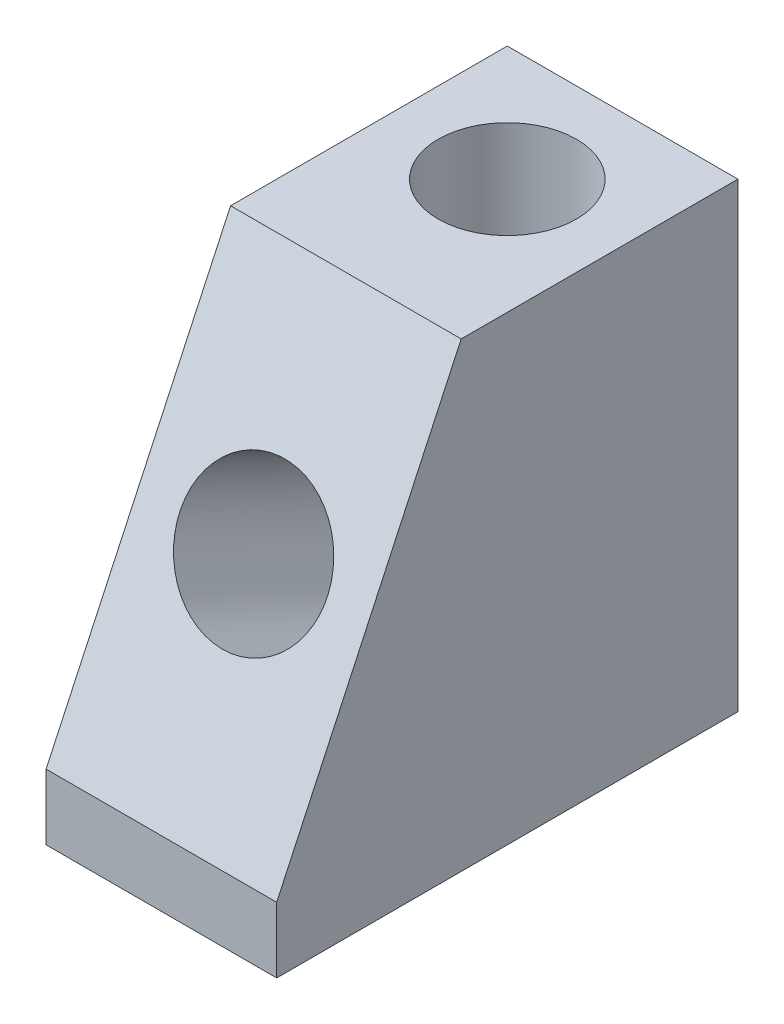
ISO-10303-21;
HEADER;
FILE_DESCRIPTION(('STEP AP214'),'2;1');
FILE_NAME('part.step','',(''),(''),'','','');
FILE_SCHEMA(('AUTOMOTIVE_DESIGN { 1 0 10303 214 1 1 1 1 }'));
ENDSEC;
DATA;
#1=APPLICATION_CONTEXT('core data for automotive mechanical design processes');
#2=APPLICATION_PROTOCOL_DEFINITION('international standard','automotive_design',2000,#1);
#3=PRODUCT_CONTEXT('',#1,'mechanical');
#4=PRODUCT('Part','Part','',(#3));
#5=PRODUCT_RELATED_PRODUCT_CATEGORY('part','',(#4));
#6=PRODUCT_DEFINITION_FORMATION('','',#4);
#7=PRODUCT_DEFINITION_CONTEXT('part definition',#1,'design');
#8=PRODUCT_DEFINITION('design','',#6,#7);
#9=PRODUCT_DEFINITION_SHAPE('','',#8);
#10=(LENGTH_UNIT() NAMED_UNIT(*) SI_UNIT(.MILLI.,.METRE.));
#11=(NAMED_UNIT(*) PLANE_ANGLE_UNIT() SI_UNIT($,.RADIAN.));
#12=(NAMED_UNIT(*) SI_UNIT($,.STERADIAN.) SOLID_ANGLE_UNIT());
#13=UNCERTAINTY_MEASURE_WITH_UNIT(LENGTH_MEASURE(1.E-05),#10,'distance_accuracy_value','');
#14=(GEOMETRIC_REPRESENTATION_CONTEXT(3) GLOBAL_UNCERTAINTY_ASSIGNED_CONTEXT((#13)) GLOBAL_UNIT_ASSIGNED_CONTEXT((#10,
#11,#12)) REPRESENTATION_CONTEXT('',''));
#15=CARTESIAN_POINT('',(0.,0.,0.));
#16=DIRECTION('',(0.,0.,1.));
#17=DIRECTION('',(1.,0.,0.));
#18=AXIS2_PLACEMENT_3D('',#15,#16,#17);
#19=CARTESIAN_POINT('',(2.5,10.,-7.5));
#20=DIRECTION('',(0.,-1.,0.));
#21=DIRECTION('',(0.,0.,-1.));
#22=AXIS2_PLACEMENT_3D('',#19,#20,#21);
#23=CYLINDRICAL_SURFACE('',#22,1.5);
#24=CARTESIAN_POINT('',(2.5,4.21223722223587,-9.));
#25=CARTESIAN_POINT('',(2.42330762249289,4.21223392992331,-8.99999513359401));
#26=CARTESIAN_POINT('',(2.34653717387851,4.20887122307844,-8.99408294465786));
#27=CARTESIAN_POINT('',(2.19527815618709,4.19563457547863,-8.97072174786232));
#28=CARTESIAN_POINT('',(2.12079365920482,4.18574964941164,-8.95325327573381));
#29=CARTESIAN_POINT('',(1.97651950271111,4.1601619341477,-8.90771798329861));
#30=CARTESIAN_POINT('',(1.90671408170912,4.14447997030643,-8.87968909353124));
#31=CARTESIAN_POINT('',(1.77312217393009,4.1082515946597,-8.8142239871317));
#32=CARTESIAN_POINT('',(1.70933296796309,4.08770739535023,-8.77679204875822));
#33=CARTESIAN_POINT('',(1.58524092715486,4.04158065306958,-8.69131265959869));
#34=CARTESIAN_POINT('',(1.52536629599283,4.01577225363752,-8.64276893676517));
#35=CARTESIAN_POINT('',(1.41417389690574,3.9615150542907,-8.5377139082359));
#36=CARTESIAN_POINT('',(1.36287649280973,3.93306021347177,-8.48118421288625));
#37=CARTESIAN_POINT('',(1.289649004553,3.88809002136716,-8.38708608725011));
#38=CARTESIAN_POINT('',(1.26458680577703,3.87171127951633,-8.35183863077607));
#39=CARTESIAN_POINT('',(1.21752105511538,3.83937871888568,-8.27917920409633));
#40=CARTESIAN_POINT('',(1.19551633793741,3.82342474010116,-8.24176806627225));
#41=CARTESIAN_POINT('',(1.1547039586765,3.79276230899111,-8.16488310867486));
#42=CARTESIAN_POINT('',(1.13588849463453,3.77805086263482,-8.1254146407083));
#43=CARTESIAN_POINT('',(1.10155125728673,3.75105223237606,-8.04431220144736));
#44=CARTESIAN_POINT('',(1.08602418756068,3.73876115241037,-8.00268184895877));
#45=CARTESIAN_POINT('',(1.06105465687156,3.72044057261015,-7.92517111105083));
#46=CARTESIAN_POINT('',(1.05101752408504,3.71367103431509,-7.88966498716163));
#47=CARTESIAN_POINT('',(1.0335203838158,3.70465031215013,-7.81749895590021));
#48=CARTESIAN_POINT('',(1.02605229122719,3.70238484377743,-7.7808430718622));
#49=CARTESIAN_POINT('',(1.01478144086655,3.70399504897451,-7.71247647320983));
#50=CARTESIAN_POINT('',(1.0106054717743,3.70703242652365,-7.68081472136506));
#51=CARTESIAN_POINT('',(1.00433560215379,3.71831388292309,-7.61822241410979));
#52=CARTESIAN_POINT('',(1.00224059640247,3.72655519409699,-7.58729147908534));
#53=CARTESIAN_POINT('',(0.999946295177163,3.74777875563823,-7.52723601320645));
#54=CARTESIAN_POINT('',(0.999737917319811,3.76073797932328,-7.49810349912474));
#55=CARTESIAN_POINT('',(1.00086403667655,3.79033023029926,-7.44180183658758));
#56=CARTESIAN_POINT('',(1.0022009463422,3.80696896909554,-7.41463582861313));
#57=CARTESIAN_POINT('',(1.00675021294701,3.84863802452953,-7.35362694563653));
#58=CARTESIAN_POINT('',(1.01043178746152,3.87463593374306,-7.32049344257166));
#59=CARTESIAN_POINT('',(1.01950532834895,3.92932541290561,-7.2567460327635));
#60=CARTESIAN_POINT('',(1.02490090670906,3.95802258038565,-7.22613762040821));
#61=CARTESIAN_POINT('',(1.03720367175321,4.01723267671696,-7.16659758369506));
#62=CARTESIAN_POINT('',(1.04412216907047,4.04775787696652,-7.13768067207515));
#63=CARTESIAN_POINT('',(1.05932983035496,4.10979116946164,-7.08128816094391));
#64=CARTESIAN_POINT('',(1.067619593825,4.14129968669281,-7.05381319878867));
#65=CARTESIAN_POINT('',(1.09610925673253,4.24251241559974,-6.96806811277513));
#66=CARTESIAN_POINT('',(1.11878944778657,4.31326872407115,-6.91185358853438));
#67=CARTESIAN_POINT('',(1.17052280338618,4.45514366247459,-6.80277802630925));
#68=CARTESIAN_POINT('',(1.1995837025293,4.52626262892469,-6.74992115956091));
#69=CARTESIAN_POINT('',(1.26439866725518,4.66698818907019,-6.64738900318956));
#70=CARTESIAN_POINT('',(1.30010918296998,4.73660150795882,-6.59769568580732));
#71=CARTESIAN_POINT('',(1.37912127633693,4.8734121886831,-6.50124441393895));
#72=CARTESIAN_POINT('',(1.42241257959403,4.94061267399527,-6.4544826013534));
#73=CARTESIAN_POINT('',(1.51070275181982,5.0614343862897,-6.37110197825496));
#74=CARTESIAN_POINT('',(1.55450258696856,5.11559422585441,-6.33400578107859));
#75=CARTESIAN_POINT('',(1.6494412934728,5.21972855177752,-6.26304136446136));
#76=CARTESIAN_POINT('',(1.70059144012739,5.26969641768434,-6.22917823984033));
#77=CARTESIAN_POINT('',(1.81185997509826,5.36385325651185,-6.16559620533507));
#78=CARTESIAN_POINT('',(1.87209139832378,5.40795389696297,-6.13594027310138));
#79=CARTESIAN_POINT('',(2.00147369960528,5.48602278571293,-6.08356610065351));
#80=CARTESIAN_POINT('',(2.07058633700837,5.5200325183632,-6.06081944653843));
#81=CARTESIAN_POINT('',(2.18872441954714,5.56330265493667,-6.03191489203331));
#82=CARTESIAN_POINT('',(2.2353651706665,5.57705547016753,-6.02273872873521));
#83=CARTESIAN_POINT('',(2.33074885768474,5.59795005738106,-6.00880325737052));
#84=CARTESIAN_POINT('',(2.37948977306093,5.60509804138691,-6.00403979902429));
#85=CARTESIAN_POINT('',(2.47791862704141,5.61213417699222,-5.99935084019958));
#86=CARTESIAN_POINT('',(2.52760939492366,5.61199546210785,-5.99944324356697));
#87=CARTESIAN_POINT('',(2.62618000114275,5.60440571518854,-6.00450121224601));
#88=CARTESIAN_POINT('',(2.6750595115383,5.59695179591847,-6.00946870170347));
#89=CARTESIAN_POINT('',(2.76864720025557,5.57587747613382,-6.02352474016199));
#90=CARTESIAN_POINT('',(2.81344427068626,5.56252394248289,-6.03243496576356));
#91=CARTESIAN_POINT('',(2.90028232723779,5.53068662132679,-6.05370258959758));
#92=CARTESIAN_POINT('',(2.94232218174715,5.51220074350221,-6.0660613923892));
#93=CARTESIAN_POINT('',(3.04794673041208,5.45856876359062,-6.10197018848805));
#94=CARTESIAN_POINT('',(3.10909289370975,5.42012625253008,-6.1277561879166));
#95=CARTESIAN_POINT('',(3.22347001362355,5.33590892421092,-6.18444243889166));
#96=CARTESIAN_POINT('',(3.27667769331167,5.29011333116441,-6.21535718996485));
#97=CARTESIAN_POINT('',(3.36726764312202,5.20194923987294,-6.27515056230556));
#98=CARTESIAN_POINT('',(3.40579669927178,5.16035147088573,-6.30346106828734));
#99=CARTESIAN_POINT('',(3.47839144591172,5.0746819083397,-6.36205075716396));
#100=CARTESIAN_POINT('',(3.51245389218277,5.03060834937298,-6.39233134736167));
#101=CARTESIAN_POINT('',(3.57659602417726,4.94059965986524,-6.45456148978628));
#102=CARTESIAN_POINT('',(3.60666652360471,4.89466054275019,-6.48651466338354));
#103=CARTESIAN_POINT('',(3.66311609964991,4.80152804818443,-6.55183122769838));
#104=CARTESIAN_POINT('',(3.68949425352094,4.75433436070041,-6.58519496822519));
#105=CARTESIAN_POINT('',(3.74398045382395,4.64925822171661,-6.66030289110211));
#106=CARTESIAN_POINT('',(3.77131173572406,4.59118980868495,-6.70234951367635));
#107=CARTESIAN_POINT('',(3.8214485371303,4.4745487244029,-6.78848045726772));
#108=CARTESIAN_POINT('',(3.84425078945591,4.41597572069953,-6.83256622123262));
#109=CARTESIAN_POINT('',(3.88550526925589,4.29935343777306,-6.9230737553539));
#110=CARTESIAN_POINT('',(3.90396796914357,4.24130322971325,-6.96948956673212));
#111=CARTESIAN_POINT('',(3.9366549777013,4.12688354903325,-7.0656989324888));
#112=CARTESIAN_POINT('',(3.95088495948526,4.07051191869913,-7.11548785492093));
#113=CARTESIAN_POINT('',(3.9707465389932,3.98023975061414,-7.20304175647294));
#114=CARTESIAN_POINT('',(3.97766197194851,3.94513218222246,-7.23925489797634));
#115=CARTESIAN_POINT('',(3.98907777653042,3.8785312399329,-7.31526194196179));
#116=CARTESIAN_POINT('',(3.99358246138401,3.84703149098224,-7.355049299563));
#117=CARTESIAN_POINT('',(3.99846813309645,3.79956935380887,-7.42628756563103));
#118=CARTESIAN_POINT('',(3.99969748682186,3.78182649207383,-7.45646290006844));
#119=CARTESIAN_POINT('',(4.000203224222,3.75110799520949,-7.51912904558163));
#120=CARTESIAN_POINT('',(3.99948571647177,3.73811759376213,-7.5516123035193));
#121=CARTESIAN_POINT('',(3.99568376761143,3.71805071528548,-7.6185632870877));
#122=CARTESIAN_POINT('',(3.99257930806566,3.71102531840868,-7.65304550416887));
#123=CARTESIAN_POINT('',(3.98383273665,3.70311382347832,-7.72241602737873));
#124=CARTESIAN_POINT('',(3.97818509342458,3.70224117677189,-7.75730505632844));
#125=CARTESIAN_POINT('',(3.962056248077,3.70595626184512,-7.83863012317192));
#126=CARTESIAN_POINT('',(3.95056959215159,3.71260199092554,-7.88474752379238));
#127=CARTESIAN_POINT('',(3.92367704388319,3.73128689993203,-7.97473279721208));
#128=CARTESIAN_POINT('',(3.908255168136,3.74334823152188,-8.01859059773546));
#129=CARTESIAN_POINT('',(3.87535519101158,3.76920604361189,-8.10012763220308));
#130=CARTESIAN_POINT('',(3.85817881657681,3.78275533464407,-8.13801050548902));
#131=CARTESIAN_POINT('',(3.82097932434347,3.81117341032455,-8.21184565719394));
#132=CARTESIAN_POINT('',(3.80095426362068,3.8260430929128,-8.24779659470247));
#133=CARTESIAN_POINT('',(3.73674692024954,3.87145018357429,-8.35275183431829));
#134=CARTESIAN_POINT('',(3.68840876937814,3.90280663122826,-8.41891654184859));
#135=CARTESIAN_POINT('',(3.5787722339949,3.96539853506011,-8.54574721892602));
#136=CARTESIAN_POINT('',(3.51698193829009,3.99656277047372,-8.60602292417823));
#137=CARTESIAN_POINT('',(3.38271037949167,4.05462533955259,-8.71586620149955));
#138=CARTESIAN_POINT('',(3.31023150637751,4.08152462408324,-8.76543616129604));
#139=CARTESIAN_POINT('',(3.15700413020472,4.12865754654883,-8.85128328682117));
#140=CARTESIAN_POINT('',(3.07636426063557,4.14896667305407,-8.88771157012272));
#141=CARTESIAN_POINT('',(2.90857959650378,4.18164108321874,-8.94599374813072));
#142=CARTESIAN_POINT('',(2.82145318451769,4.19402792829299,-8.96788720729574));
#143=CARTESIAN_POINT('',(2.69440513611976,4.20534594525418,-8.98786076283785));
#144=CARTESIAN_POINT('',(2.65571607066199,4.20792439196304,-8.99240477413375));
#145=CARTESIAN_POINT('',(2.57802473254135,4.2113708339856,-8.99847557068667));
#146=CARTESIAN_POINT('',(2.53902247241521,4.2122388974242,-9.00000247611562));
#147=CARTESIAN_POINT('',(2.5,4.21223722223587,-9.));
#148=B_SPLINE_CURVE_WITH_KNOTS('',3,(#24,#25,#26,#27,#28,#29,#30,#31,#32,#33,#34,#35,#36,#37,
#38,#39,#40,#41,#42,#43,#44,#45,#46,#47,#48,#49,#50,#51,#52,#53,#54,#55,#56,#57,#58,#59,#60,#61,
#62,#63,#64,#65,#66,#67,#68,#69,#70,#71,#72,#73,#74,#75,#76,#77,#78,#79,#80,#81,#82,#83,#84,#85,
#86,#87,#88,#89,#90,#91,#92,#93,#94,#95,#96,#97,#98,#99,#100,#101,#102,#103,#104,#105,#106,#107,
#108,#109,#110,#111,#112,#113,#114,#115,#116,#117,#118,#119,#120,#121,#122,#123,#124,#125,#126,
#127,#128,#129,#130,#131,#132,#133,#134,#135,#136,#137,#138,#139,#140,#141,#142,#143,#144,#145,
#146,#147),.UNSPECIFIED.,.T.,.F.,(4,2,2,2,2,2,2,2,2,2,2,2,2,2,2,2,2,2,2,2,2,2,2,2,2,2,2,2,2,2,2,
2,2,2,2,2,2,2,2,2,2,2,2,2,2,2,2,2,2,2,2,2,2,2,2,2,2,2,2,2,2,4),(0.,0.229919498192974,
0.460227239539266,0.689715535702007,0.919099606344271,1.16202686464578,1.4055229278807,
1.54413548044682,1.68269505810213,1.8209106220919,1.95890184843126,2.0711770130676,
2.18309552923044,2.27887844045119,2.37461045304469,2.46988135728232,2.56530119640829,
2.6918187001361,2.81860460781765,2.94636598180095,3.07418336002767,3.3533407310556,
3.63283837922029,3.91056610721092,4.18792029807177,4.424263109314,4.66097241669091,
4.90091745954037,5.13986195274847,5.28772859879458,5.43545603026221,5.58372817948227,
5.73205887372377,5.87427494715658,6.01654902804334,6.24531214693081,6.4747333831012,
6.66459433117967,6.85459242543552,7.04502043344909,7.23549594630567,7.46549456701785,
7.69565850777352,7.92526116843829,8.15455469136735,8.30711774390218,8.45940691552899,
8.5641496931292,8.66856420462628,8.77386408187656,8.87939409803938,9.02255364520988,
9.1663041749546,9.29736395257521,9.42851355092222,9.69061674612754,9.96471593009237,
10.2387539178004,10.5095319184228,10.7795697933361,10.8965616632803,11.0135488733211),.UNSPECIFIED.);
#149=CARTESIAN_POINT('',(2.5,4.21223722223587,-9.));
#150=VERTEX_POINT('',#149);
#151=EDGE_CURVE('E169',#150,#150,#148,.T.);
#152=ORIENTED_EDGE('',*,*,#151,.F.);
#153=EDGE_LOOP('',(#152));
#154=FACE_BOUND('',#153,.T.);
#155=CARTESIAN_POINT('',(2.5,10.,-7.5));
#156=DIRECTION('',(0.,1.,0.));
#157=DIRECTION('',(0.,0.,1.));
#158=AXIS2_PLACEMENT_3D('',#155,#156,#157);
#159=CIRCLE('',#158,1.5);
#160=CARTESIAN_POINT('',(2.5,10.,-6.));
#161=VERTEX_POINT('',#160);
#162=EDGE_CURVE('E115',#161,#161,#159,.T.);
#163=ORIENTED_EDGE('',*,*,#162,.T.);
#164=EDGE_LOOP('',(#163));
#165=FACE_BOUND('',#164,.T.);
#166=ADVANCED_FACE('F45',(#154,#165),#23,.F.);
#167=CARTESIAN_POINT('',(0.,10.,0.));
#168=DIRECTION('',(0.,-1.,0.));
#169=DIRECTION('',(0.,0.,-1.));
#170=AXIS2_PLACEMENT_3D('',#167,#168,#169);
#171=PLANE('',#170);
#172=DIRECTION('',(0.,0.,1.));
#173=VECTOR('',#172,1.);
#174=CARTESIAN_POINT('',(0.,10.,0.));
#175=LINE('',#174,#173);
#176=CARTESIAN_POINT('',(0.,10.,-10.));
#177=VERTEX_POINT('',#176);
#178=CARTESIAN_POINT('',(0.,10.,-4.));
#179=VERTEX_POINT('',#178);
#180=EDGE_CURVE('E99',#177,#179,#175,.T.);
#181=ORIENTED_EDGE('',*,*,#180,.T.);
#182=DIRECTION('',(1.,0.,0.));
#183=VECTOR('',#182,1.);
#184=CARTESIAN_POINT('',(0.,10.,-4.));
#185=LINE('',#184,#183);
#186=CARTESIAN_POINT('',(5.,10.,-4.));
#187=VERTEX_POINT('',#186);
#188=EDGE_CURVE('E145',#179,#187,#185,.T.);
#189=ORIENTED_EDGE('',*,*,#188,.T.);
#190=DIRECTION('',(0.,0.,-1.));
#191=VECTOR('',#190,1.);
#192=CARTESIAN_POINT('',(5.,10.,0.));
#193=LINE('',#192,#191);
#194=CARTESIAN_POINT('',(5.,10.,-10.));
#195=VERTEX_POINT('',#194);
#196=EDGE_CURVE('E151',#187,#195,#193,.T.);
#197=ORIENTED_EDGE('',*,*,#196,.T.);
#198=DIRECTION('',(-1.,0.,0.));
#199=VECTOR('',#198,1.);
#200=CARTESIAN_POINT('',(0.,10.,-10.));
#201=LINE('',#200,#199);
#202=EDGE_CURVE('E70',#195,#177,#201,.T.);
#203=ORIENTED_EDGE('',*,*,#202,.T.);
#204=EDGE_LOOP('',(#181,#189,#197,#203));
#205=FACE_BOUND('',#204,.T.);
#206=ORIENTED_EDGE('',*,*,#162,.F.);
#207=EDGE_LOOP('',(#206));
#208=FACE_BOUND('',#207,.T.);
#209=ADVANCED_FACE('F149',(#205,#208),#171,.F.);
#210=CARTESIAN_POINT('',(0.,0.,0.));
#211=DIRECTION('',(0.,-1.,0.));
#212=DIRECTION('',(0.,0.,-1.));
#213=AXIS2_PLACEMENT_3D('',#210,#211,#212);
#214=PLANE('',#213);
#215=DIRECTION('',(0.,0.,1.));
#216=VECTOR('',#215,1.);
#217=CARTESIAN_POINT('',(0.,0.,0.));
#218=LINE('',#217,#216);
#219=CARTESIAN_POINT('',(0.,0.,-10.));
#220=VERTEX_POINT('',#219);
#221=CARTESIAN_POINT('',(0.,0.,0.));
#222=VERTEX_POINT('',#221);
#223=EDGE_CURVE('E105',#220,#222,#218,.T.);
#224=ORIENTED_EDGE('',*,*,#223,.F.);
#225=DIRECTION('',(-1.,0.,0.));
#226=VECTOR('',#225,1.);
#227=CARTESIAN_POINT('',(0.,0.,-10.));
#228=LINE('',#227,#226);
#229=CARTESIAN_POINT('',(5.,0.,-10.));
#230=VERTEX_POINT('',#229);
#231=EDGE_CURVE('E88',#230,#220,#228,.T.);
#232=ORIENTED_EDGE('',*,*,#231,.F.);
#233=DIRECTION('',(0.,0.,-1.));
#234=VECTOR('',#233,1.);
#235=CARTESIAN_POINT('',(5.,0.,0.));
#236=LINE('',#235,#234);
#237=CARTESIAN_POINT('',(5.,0.,0.));
#238=VERTEX_POINT('',#237);
#239=EDGE_CURVE('E100',#238,#230,#236,.T.);
#240=ORIENTED_EDGE('',*,*,#239,.F.);
#241=DIRECTION('',(1.,0.,0.));
#242=VECTOR('',#241,1.);
#243=CARTESIAN_POINT('',(0.,0.,0.));
#244=LINE('',#243,#242);
#245=EDGE_CURVE('E113',#222,#238,#244,.T.);
#246=ORIENTED_EDGE('',*,*,#245,.F.);
#247=EDGE_LOOP('',(#224,#232,#240,#246));
#248=FACE_BOUND('',#247,.T.);
#249=CARTESIAN_POINT('',(2.5,0.,-7.5));
#250=DIRECTION('',(0.,1.,0.));
#251=DIRECTION('',(0.,0.,1.));
#252=AXIS2_PLACEMENT_3D('',#249,#250,#251);
#253=CIRCLE('',#252,1.5);
#254=CARTESIAN_POINT('',(2.5,0.,-6.));
#255=VERTEX_POINT('',#254);
#256=EDGE_CURVE('E121',#255,#255,#253,.T.);
#257=ORIENTED_EDGE('',*,*,#256,.T.);
#258=EDGE_LOOP('',(#257));
#259=FACE_BOUND('',#258,.T.);
#260=ADVANCED_FACE('F110',(#248,#259),#214,.T.);
#261=CARTESIAN_POINT('',(0.,10.,0.));
#262=DIRECTION('',(1.,0.,0.));
#263=DIRECTION('',(0.,0.,-1.));
#264=AXIS2_PLACEMENT_3D('',#261,#262,#263);
#265=PLANE('',#264);
#266=DIRECTION('',(0.,-1.,0.));
#267=VECTOR('',#266,1.);
#268=CARTESIAN_POINT('',(0.,10.,0.));
#269=LINE('',#268,#267);
#270=CARTESIAN_POINT('',(0.,1.42197231796171,0.));
#271=VERTEX_POINT('',#270);
#272=EDGE_CURVE('E11',#271,#222,#269,.T.);
#273=ORIENTED_EDGE('',*,*,#272,.F.);
#274=DIRECTION('',(0.,0.906307787036651,-0.422618261740697));
#275=VECTOR('',#274,1.);
#276=CARTESIAN_POINT('',(0.,1.42197231796171,0.));
#277=LINE('',#276,#275);
#278=EDGE_CURVE('E138',#271,#179,#277,.T.);
#279=ORIENTED_EDGE('',*,*,#278,.T.);
#280=ORIENTED_EDGE('',*,*,#180,.F.);
#281=DIRECTION('',(0.,-1.,0.));
#282=VECTOR('',#281,1.);
#283=CARTESIAN_POINT('',(0.,10.,-10.));
#284=LINE('',#283,#282);
#285=EDGE_CURVE('E91',#177,#220,#284,.T.);
#286=ORIENTED_EDGE('',*,*,#285,.T.);
#287=ORIENTED_EDGE('',*,*,#223,.T.);
#288=EDGE_LOOP('',(#273,#279,#280,#286,#287));
#289=FACE_BOUND('',#288,.T.);
#290=ADVANCED_FACE('F47',(#289),#265,.F.);
#291=CARTESIAN_POINT('',(0.,10.,0.));
#292=DIRECTION('',(0.,0.,-1.));
#293=DIRECTION('',(-1.,0.,0.));
#294=AXIS2_PLACEMENT_3D('',#291,#292,#293);
#295=PLANE('',#294);
#296=DIRECTION('',(0.,-1.,0.));
#297=VECTOR('',#296,1.);
#298=CARTESIAN_POINT('',(5.,10.,0.));
#299=LINE('',#298,#297);
#300=CARTESIAN_POINT('',(5.,1.42197231796171,0.));
#301=VERTEX_POINT('',#300);
#302=EDGE_CURVE('E54',#301,#238,#299,.T.);
#303=ORIENTED_EDGE('',*,*,#302,.F.);
#304=DIRECTION('',(1.,0.,0.));
#305=VECTOR('',#304,1.);
#306=CARTESIAN_POINT('',(0.,1.42197231796171,0.));
#307=LINE('',#306,#305);
#308=EDGE_CURVE('E61',#271,#301,#307,.T.);
#309=ORIENTED_EDGE('',*,*,#308,.F.);
#310=ORIENTED_EDGE('',*,*,#272,.T.);
#311=ORIENTED_EDGE('',*,*,#245,.T.);
#312=EDGE_LOOP('',(#303,#309,#310,#311));
#313=FACE_BOUND('',#312,.T.);
#314=ADVANCED_FACE('F136',(#313),#295,.F.);
#315=CARTESIAN_POINT('',(5.,10.,0.));
#316=DIRECTION('',(-1.,0.,0.));
#317=DIRECTION('',(0.,0.,1.));
#318=AXIS2_PLACEMENT_3D('',#315,#316,#317);
#319=PLANE('',#318);
#320=ORIENTED_EDGE('',*,*,#196,.F.);
#321=DIRECTION('',(0.,0.906307787036651,-0.422618261740697));
#322=VECTOR('',#321,1.);
#323=CARTESIAN_POINT('',(5.,1.42197231796171,0.));
#324=LINE('',#323,#322);
#325=EDGE_CURVE('E134',#301,#187,#324,.T.);
#326=ORIENTED_EDGE('',*,*,#325,.F.);
#327=ORIENTED_EDGE('',*,*,#302,.T.);
#328=ORIENTED_EDGE('',*,*,#239,.T.);
#329=DIRECTION('',(0.,-1.,0.));
#330=VECTOR('',#329,1.);
#331=CARTESIAN_POINT('',(5.,10.,-10.));
#332=LINE('',#331,#330);
#333=EDGE_CURVE('E94',#195,#230,#332,.T.);
#334=ORIENTED_EDGE('',*,*,#333,.F.);
#335=EDGE_LOOP('',(#320,#326,#327,#328,#334));
#336=FACE_BOUND('',#335,.T.);
#337=ADVANCED_FACE('F133',(#336),#319,.F.);
#338=CARTESIAN_POINT('',(0.,10.,-10.));
#339=DIRECTION('',(0.,0.,1.));
#340=DIRECTION('',(1.,0.,0.));
#341=AXIS2_PLACEMENT_3D('',#338,#339,#340);
#342=PLANE('',#341);
#343=CARTESIAN_POINT('',(2.5,1.98052489374089,-10.));
#344=DIRECTION('',(0.,0.,1.));
#345=DIRECTION('',(0.,1.,0.));
#346=AXIS2_PLACEMENT_3D('',#343,#344,#345);
#347=ELLIPSE('',#346,1.76540467033999,1.6);
#348=CARTESIAN_POINT('',(2.5,3.74592956408088,-10.));
#349=VERTEX_POINT('',#348);
#350=EDGE_CURVE('E147',#349,#349,#347,.T.);
#351=ORIENTED_EDGE('',*,*,#350,.T.);
#352=EDGE_LOOP('',(#351));
#353=FACE_BOUND('',#352,.T.);
#354=ORIENTED_EDGE('',*,*,#231,.T.);
#355=ORIENTED_EDGE('',*,*,#285,.F.);
#356=ORIENTED_EDGE('',*,*,#202,.F.);
#357=ORIENTED_EDGE('',*,*,#333,.T.);
#358=EDGE_LOOP('',(#354,#355,#356,#357));
#359=FACE_BOUND('',#358,.T.);
#360=ADVANCED_FACE('F90',(#353,#359),#342,.F.);
#361=CARTESIAN_POINT('',(2.5,0.681427881555901,-9.));
#362=CARTESIAN_POINT('',(2.54955592537213,0.681433043145041,-8.99999662573214));
#363=CARTESIAN_POINT('',(2.59915805375772,0.685151708425578,-8.99751917877609));
#364=CARTESIAN_POINT('',(2.69686254083038,0.699670789554327,-8.98784040605343));
#365=CARTESIAN_POINT('',(2.74496221922613,0.710483179947618,-8.9806310926626));
#366=CARTESIAN_POINT('',(2.84860569768238,0.741274087709084,-8.96008014432846));
#367=CARTESIAN_POINT('',(2.90351028195603,0.762729038056097,-8.94574960593815));
#368=CARTESIAN_POINT('',(3.00837894507439,0.812713506948319,-8.91230184242844));
#369=CARTESIAN_POINT('',(3.05833528926177,0.841253864051683,-8.89317728344805));
#370=CARTESIAN_POINT('',(3.1768498756709,0.919131456278822,-8.84086602257118));
#371=CARTESIAN_POINT('',(3.24223987227099,0.971736947102122,-8.80542618180104));
#372=CARTESIAN_POINT('',(3.36270802052551,1.08434066762894,-8.72916300798057));
#373=CARTESIAN_POINT('',(3.41775601376666,1.1443596976457,-8.68832450419806));
#374=CARTESIAN_POINT('',(3.51180754379575,1.26033236411242,-8.6088199023928));
#375=CARTESIAN_POINT('',(3.55197768690795,1.31569130654839,-8.57064099421687));
#376=CARTESIAN_POINT('',(3.62645094183708,1.42873153556153,-8.49199050856356));
#377=CARTESIAN_POINT('',(3.66074924455068,1.48641467837591,-8.45151708762277));
#378=CARTESIAN_POINT('',(3.72405540675641,1.60316865953911,-8.36856718947838));
#379=CARTESIAN_POINT('',(3.75306484641886,1.66223907743379,-8.32609131534326));
#380=CARTESIAN_POINT('',(3.80625732213258,1.78099898002964,-8.23911475309811));
#381=CARTESIAN_POINT('',(3.83044277332946,1.84068813912963,-8.19461509197705));
#382=CARTESIAN_POINT('',(3.87402005837175,1.95908834955143,-8.10379977976635));
#383=CARTESIAN_POINT('',(3.89347041276984,2.01780198842404,-8.05751546492285));
#384=CARTESIAN_POINT('',(3.92810737147389,2.1339526568678,-7.96165028925384));
#385=CARTESIAN_POINT('',(3.94328962381425,2.19138832882307,-7.91206612697608));
#386=CARTESIAN_POINT('',(3.96657500728673,2.29175041200268,-7.81786199908565));
#387=CARTESIAN_POINT('',(3.97547999121763,2.33533060753288,-7.77414395969692));
#388=CARTESIAN_POINT('',(3.98972128236912,2.41726818905859,-7.68146701062271));
#389=CARTESIAN_POINT('',(3.99507186303833,2.45564596577025,-7.63252998974262));
#390=CARTESIAN_POINT('',(3.99941555135822,2.50649491545508,-7.55084411091856));
#391=CARTESIAN_POINT('',(4.00018413583765,2.52286305956557,-7.52068633922016));
#392=CARTESIAN_POINT('',(3.9997418347249,2.55066322063089,-7.45823770328991));
#393=CARTESIAN_POINT('',(3.9985375219014,2.56211146809413,-7.42595426444572));
#394=CARTESIAN_POINT('',(3.99380479842276,2.57916880538816,-7.35983225239899));
#395=CARTESIAN_POINT('',(3.99026336358666,2.58474471553009,-7.32598595858748));
#396=CARTESIAN_POINT('',(3.9807705630394,2.59021011343299,-7.25813251831667));
#397=CARTESIAN_POINT('',(3.97481245473462,2.59008358154544,-7.2241251870986));
#398=CARTESIAN_POINT('',(3.9574111459619,2.5843465155692,-7.14159519558975));
#399=CARTESIAN_POINT('',(3.9447056080437,2.57625684897592,-7.09353948188223));
#400=CARTESIAN_POINT('',(3.91506379335607,2.55472730251898,-6.9999732757685));
#401=CARTESIAN_POINT('',(3.89811119752092,2.54126666395415,-6.9544734494421));
#402=CARTESIAN_POINT('',(3.86230760883905,2.51312349878182,-6.87074380444731));
#403=CARTESIAN_POINT('',(3.84384272296967,2.49871757970352,-6.83225221738486));
#404=CARTESIAN_POINT('',(3.8039229902848,2.46875943053439,-6.75730929332502));
#405=CARTESIAN_POINT('',(3.78246624813671,2.45320647676577,-6.72085927033194));
#406=CARTESIAN_POINT('',(3.71374678721229,2.40598144633677,-6.61459922324736));
#407=CARTESIAN_POINT('',(3.66210645509514,2.37371833069893,-6.54781359356547));
#408=CARTESIAN_POINT('',(3.54592830069021,2.3102997171884,-6.42127784359446));
#409=CARTESIAN_POINT('',(3.48102518627014,2.27921451969966,-6.36182771779638));
#410=CARTESIAN_POINT('',(3.34042223579036,2.22191822292931,-6.25440859517854));
#411=CARTESIAN_POINT('',(3.26472996348681,2.19570373843639,-6.20643161765828));
#412=CARTESIAN_POINT('',(3.10764380681302,2.15122981015611,-6.12587186272498));
#413=CARTESIAN_POINT('',(3.02662123320902,2.13268329874849,-6.09272874392236));
#414=CARTESIAN_POINT('',(2.85873159610023,2.10353967132805,-6.04088844720228));
#415=CARTESIAN_POINT('',(2.77186994937913,2.09293529550646,-6.02217807601743));
#416=CARTESIAN_POINT('',(2.60704919401412,2.08139158063396,-6.00182639295126));
#417=CARTESIAN_POINT('',(2.52939445293446,2.07937817514392,-5.99828791690413));
#418=CARTESIAN_POINT('',(2.37460925642806,2.08219625883197,-6.00324835706087));
#419=CARTESIAN_POINT('',(2.2974786408747,2.08702555342162,-6.01174341387396));
#420=CARTESIAN_POINT('',(2.14989515635012,2.10278488427869,-6.03959279186756));
#421=CARTESIAN_POINT('',(2.07930086761253,2.11340015460374,-6.05838708157286));
#422=CARTESIAN_POINT('',(1.94246582157922,2.13986549046622,-6.10558407685278));
#423=CARTESIAN_POINT('',(1.87622530698423,2.15571584753681,-6.13398731753583));
#424=CARTESIAN_POINT('',(1.74595265384341,2.19276816178194,-6.20112584205979));
#425=CARTESIAN_POINT('',(1.6822389995375,2.21421522995947,-6.24034091252663));
#426=CARTESIAN_POINT('',(1.56214138433142,2.26075306944329,-6.32700626056168));
#427=CARTESIAN_POINT('',(1.50576355372678,2.28584685158646,-6.37446334936662));
#428=CARTESIAN_POINT('',(1.39458485892827,2.34143993058268,-6.4827475034267));
#429=CARTESIAN_POINT('',(1.34083233687458,2.37222439040948,-6.54450125455703));
#430=CARTESIAN_POINT('',(1.24403753164523,2.43388323870481,-6.67585090489522));
#431=CARTESIAN_POINT('',(1.20098897897705,2.46475756376479,-6.74544217866324));
#432=CARTESIAN_POINT('',(1.14206768791746,2.50957940946981,-6.86104491514881));
#433=CARTESIAN_POINT('',(1.12241563413859,2.52514933468637,-6.90452769684605));
#434=CARTESIAN_POINT('',(1.08704661019611,2.55291015022662,-6.99415534596196));
#435=CARTESIAN_POINT('',(1.07132675699733,2.56510351690271,-7.04029823230435));
#436=CARTESIAN_POINT('',(1.04780637977911,2.58074893975629,-7.12257748355417));
#437=CARTESIAN_POINT('',(1.0390108720713,2.58565951981264,-7.15813555412367));
#438=CARTESIAN_POINT('',(1.02402954168148,2.59031958178172,-7.23008961665007));
#439=CARTESIAN_POINT('',(1.01783494874338,2.59008655265705,-7.26648234904507));
#440=CARTESIAN_POINT('',(1.0081523485447,2.58291705933214,-7.3395017247023));
#441=CARTESIAN_POINT('',(1.00469911461672,2.57589690155345,-7.37612561183541));
#442=CARTESIAN_POINT('',(1.00048953851877,2.55494746699883,-7.44750824390914));
#443=CARTESIAN_POINT('',(0.999736648927647,2.54100937104247,-7.48226454515563));
#444=CARTESIAN_POINT('',(1.00051832463327,2.50341911837735,-7.55790826615202));
#445=CARTESIAN_POINT('',(1.00271499662198,2.47816890733858,-7.59796563445346));
#446=CARTESIAN_POINT('',(1.00966107633954,2.42263125397454,-7.67425359296991));
#447=CARTESIAN_POINT('',(1.01442310265392,2.39231942726437,-7.71046419843377));
#448=CARTESIAN_POINT('',(1.02909721646101,2.31163899872089,-7.79905497792241));
#449=CARTESIAN_POINT('',(1.04040152217735,2.25937405717537,-7.84943616496406));
#450=CARTESIAN_POINT('',(1.06702340727509,2.15215058005262,-7.94618269700138));
#451=CARTESIAN_POINT('',(1.08235015112349,2.09718612956918,-7.99253854575902));
#452=CARTESIAN_POINT('',(1.11698368342551,1.98596497123263,-8.08276097809117));
#453=CARTESIAN_POINT('',(1.13631102939054,1.92970297814768,-8.12661314929409));
#454=CARTESIAN_POINT('',(1.17898942209372,1.81719671728622,-8.21218793889292));
#455=CARTESIAN_POINT('',(1.20233615406403,1.76095249463726,-8.25391277933359));
#456=CARTESIAN_POINT('',(1.25579687984318,1.6437114862642,-8.33949049678582));
#457=CARTESIAN_POINT('',(1.28634602563259,1.58277855332879,-8.38316142546676));
#458=CARTESIAN_POINT('',(1.35318436744864,1.46246839524254,-8.46837394749778));
#459=CARTESIAN_POINT('',(1.389478573988,1.40309258130829,-8.50991363983806));
#460=CARTESIAN_POINT('',(1.46819798648952,1.28739549510422,-8.5901936065715));
#461=CARTESIAN_POINT('',(1.5105737528221,1.2310541979767,-8.62895299910689));
#462=CARTESIAN_POINT('',(1.60248144449063,1.1223455788497,-8.70330756223088));
#463=CARTESIAN_POINT('',(1.65200036813535,1.06997129485416,-8.73890829593014));
#464=CARTESIAN_POINT('',(1.74734501812448,0.982044061633933,-8.79843324257603));
#465=CARTESIAN_POINT('',(1.79156461236098,0.945332924307403,-8.82319834794855));
#466=CARTESIAN_POINT('',(1.88542971995041,0.876799328483915,-8.86932017577303));
#467=CARTESIAN_POINT('',(1.93508048503966,0.844981674600005,-8.89067354924263));
#468=CARTESIAN_POINT('',(2.04053619475623,0.787756464741277,-8.92901426047654));
#469=CARTESIAN_POINT('',(2.0964132064663,0.762438293369107,-8.94594077129625));
#470=CARTESIAN_POINT('',(2.21293086499887,0.721211748177463,-8.97347606710598));
#471=CARTESIAN_POINT('',(2.27355170471683,0.70526639032499,-8.98410968426523));
#472=CARTESIAN_POINT('',(2.36253483356989,0.690522585354982,-8.99393896723114));
#473=CARTESIAN_POINT('',(2.38985908864516,0.687124270417553,-8.99620389889989));
#474=CARTESIAN_POINT('',(2.44478408138799,0.68257528201165,-8.99923548766518));
#475=CARTESIAN_POINT('',(2.47238486699079,0.681425005250604,-9.00000188031714));
#476=CARTESIAN_POINT('',(2.5,0.681427881555901,-9.));
#477=B_SPLINE_CURVE_WITH_KNOTS('',3,(#361,#362,#363,#364,#365,#366,#367,#368,#369,#370,#371,
#372,#373,#374,#375,#376,#377,#378,#379,#380,#381,#382,#383,#384,#385,#386,#387,#388,#389,#390,
#391,#392,#393,#394,#395,#396,#397,#398,#399,#400,#401,#402,#403,#404,#405,#406,#407,#408,#409,
#410,#411,#412,#413,#414,#415,#416,#417,#418,#419,#420,#421,#422,#423,#424,#425,#426,#427,#428,
#429,#430,#431,#432,#433,#434,#435,#436,#437,#438,#439,#440,#441,#442,#443,#444,#445,#446,#447,
#448,#449,#450,#451,#452,#453,#454,#455,#456,#457,#458,#459,#460,#461,#462,#463,#464,#465,#466,
#467,#468,#469,#470,#471,#472,#473,#474,#475,#476),.UNSPECIFIED.,.T.,.F.,(4,2,2,2,2,2,2,2,2,2,2,
2,2,2,2,2,2,2,2,2,2,2,2,2,2,2,2,2,2,2,2,2,2,2,2,2,2,2,2,2,2,2,2,2,2,2,2,2,2,2,2,2,2,2,2,2,2,4),
(0.,0.148555875380434,0.297363167596171,0.478346368653836,0.65960814454183,0.931385698582414,
1.20394388505242,1.43861311371025,1.67347362907119,1.90826385900826,2.1429362437534,
2.37454149137931,2.60638204551072,2.79326452652805,2.97939193079653,3.08198959335484,
3.18424614321895,3.28707740979538,3.39019757420671,3.54043154366454,3.69125187778232,
3.82623958831857,3.96131320502604,4.23123590286552,4.50995001680079,4.7884696900851,
5.05533032684653,5.32194673084881,5.5540254343696,5.78602972253343,6.00651643223456,
6.22701542253981,6.45956377430451,6.69230522744854,6.95369549589916,7.21493230116478,
7.3652891987764,7.51553553151676,7.62607457713913,7.73623783322378,7.84777709461206,
7.95945891599988,8.10086356708938,8.24297020305919,8.46286491100918,8.68326502914174,
8.9048271375359,9.12615286776811,9.36878983130068,9.61163958680569,9.85261652978147,
10.0931602646372,10.2804939537541,10.4680104160602,10.6579821038153,10.8471990640136,
10.9299675014594,11.0127505435906),.UNSPECIFIED.);
#478=CARTESIAN_POINT('',(2.5,0.681427881555901,-9.));
#479=VERTEX_POINT('',#478);
#480=EDGE_CURVE('E178',#479,#479,#477,.T.);
#481=ORIENTED_EDGE('',*,*,#480,.F.);
#482=EDGE_LOOP('',(#481));
#483=FACE_BOUND('',#482,.T.);
#484=ORIENTED_EDGE('',*,*,#256,.F.);
#485=EDGE_LOOP('',(#484));
#486=FACE_BOUND('',#485,.T.);
#487=ADVANCED_FACE('F183',(#483,#486),#23,.F.);
#488=CARTESIAN_POINT('',(0.,1.42197231796171,0.));
#489=DIRECTION('',(0.,-0.422618261740697,-0.906307787036651));
#490=DIRECTION('',(0.,0.906307787036651,-0.422618261740697));
#491=AXIS2_PLACEMENT_3D('',#488,#489,#490);
#492=PLANE('',#491);
#493=CARTESIAN_POINT('',(2.5,5.71098615898086,-2.));
#494=DIRECTION('',(0.,0.422618261740697,0.906307787036651));
#495=DIRECTION('',(0.,-0.906307787036651,0.422618261740697));
#496=AXIS2_PLACEMENT_3D('',#493,#494,#495);
#497=CIRCLE('',#496,1.6);
#498=CARTESIAN_POINT('',(2.5,4.26089369972221,-1.32381078121488));
#499=VERTEX_POINT('',#498);
#500=EDGE_CURVE('E276',#499,#499,#497,.T.);
#501=ORIENTED_EDGE('',*,*,#500,.F.);
#502=EDGE_LOOP('',(#501));
#503=FACE_BOUND('',#502,.T.);
#504=ORIENTED_EDGE('',*,*,#325,.T.);
#505=ORIENTED_EDGE('',*,*,#188,.F.);
#506=ORIENTED_EDGE('',*,*,#278,.F.);
#507=ORIENTED_EDGE('',*,*,#308,.T.);
#508=EDGE_LOOP('',(#504,#505,#506,#507));
#509=FACE_BOUND('',#508,.T.);
#510=ADVANCED_FACE('F144',(#503,#509),#492,.F.);
#511=CARTESIAN_POINT('',(2.5,1.62679087805665,-10.7585850446545));
#512=DIRECTION('',(0.,0.422618261740697,0.906307787036651));
#513=DIRECTION('',(0.,-0.906307787036651,0.422618261740697));
#514=AXIS2_PLACEMENT_3D('',#511,#512,#513);
#515=CYLINDRICAL_SURFACE('',#514,1.6);
#516=ORIENTED_EDGE('',*,*,#500,.T.);
#517=EDGE_LOOP('',(#516));
#518=FACE_BOUND('',#517,.T.);
#519=ORIENTED_EDGE('',*,*,#480,.T.);
#520=EDGE_LOOP('',(#519));
#521=FACE_BOUND('',#520,.T.);
#522=ORIENTED_EDGE('',*,*,#151,.T.);
#523=EDGE_LOOP('',(#522));
#524=FACE_BOUND('',#523,.T.);
#525=ORIENTED_EDGE('',*,*,#350,.F.);
#526=EDGE_LOOP('',(#525));
#527=FACE_BOUND('',#526,.T.);
#528=ADVANCED_FACE('F187',(#518,#521,#524,#527),#515,.F.);
#529=CLOSED_SHELL('',(#166,#209,#260,#290,#314,#337,#360,#487,#510,#528));
#530=MANIFOLD_SOLID_BREP('B2',#529);
#531=ADVANCED_BREP_SHAPE_REPRESENTATION('',(#18,#530),#14);
#532=SHAPE_DEFINITION_REPRESENTATION(#9,#531);
ENDSEC;
END-ISO-10303-21;
